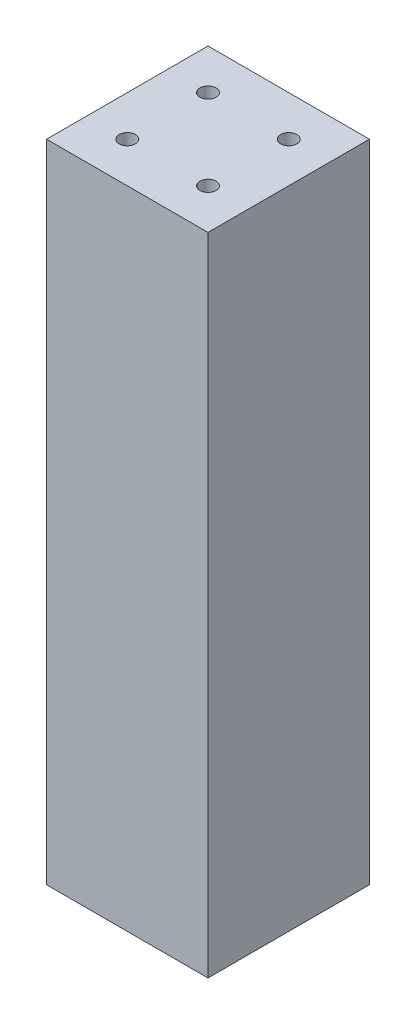
ISO-10303-21;
HEADER;
FILE_DESCRIPTION(('STEP AP214'),'2;1');
FILE_NAME('part.step','',(''),(''),'','','');
FILE_SCHEMA(('AUTOMOTIVE_DESIGN { 1 0 10303 214 1 1 1 1 }'));
ENDSEC;
DATA;
#1=APPLICATION_CONTEXT('core data for automotive mechanical design processes');
#2=APPLICATION_PROTOCOL_DEFINITION('international standard','automotive_design',2000,#1);
#3=PRODUCT_CONTEXT('',#1,'mechanical');
#4=PRODUCT('Part','Part','',(#3));
#5=PRODUCT_RELATED_PRODUCT_CATEGORY('part','',(#4));
#6=PRODUCT_DEFINITION_FORMATION('','',#4);
#7=PRODUCT_DEFINITION_CONTEXT('part definition',#1,'design');
#8=PRODUCT_DEFINITION('design','',#6,#7);
#9=PRODUCT_DEFINITION_SHAPE('','',#8);
#10=(LENGTH_UNIT() NAMED_UNIT(*) SI_UNIT(.MILLI.,.METRE.));
#11=(NAMED_UNIT(*) PLANE_ANGLE_UNIT() SI_UNIT($,.RADIAN.));
#12=(NAMED_UNIT(*) SI_UNIT($,.STERADIAN.) SOLID_ANGLE_UNIT());
#13=UNCERTAINTY_MEASURE_WITH_UNIT(LENGTH_MEASURE(1.E-05),#10,'distance_accuracy_value','');
#14=(GEOMETRIC_REPRESENTATION_CONTEXT(3) GLOBAL_UNCERTAINTY_ASSIGNED_CONTEXT((#13)) GLOBAL_UNIT_ASSIGNED_CONTEXT((#10,
#11,#12)) REPRESENTATION_CONTEXT('',''));
#15=CARTESIAN_POINT('',(0.,0.,0.));
#16=DIRECTION('',(0.,0.,1.));
#17=DIRECTION('',(1.,0.,0.));
#18=AXIS2_PLACEMENT_3D('',#15,#16,#17);
#19=CARTESIAN_POINT('',(25.4,203.2,25.4));
#20=DIRECTION('',(-1.,0.,0.));
#21=DIRECTION('',(0.,0.,1.));
#22=AXIS2_PLACEMENT_3D('',#19,#20,#21);
#23=PLANE('',#22);
#24=DIRECTION('',(0.,0.,-1.));
#25=VECTOR('',#24,1.);
#26=CARTESIAN_POINT('',(25.4,0.,25.4));
#27=LINE('',#26,#25);
#28=CARTESIAN_POINT('',(25.4,0.,25.4));
#29=VERTEX_POINT('',#28);
#30=CARTESIAN_POINT('',(25.4,0.,-25.4));
#31=VERTEX_POINT('',#30);
#32=EDGE_CURVE('E181',#29,#31,#27,.T.);
#33=ORIENTED_EDGE('',*,*,#32,.T.);
#34=DIRECTION('',(0.,-1.,0.));
#35=VECTOR('',#34,1.);
#36=CARTESIAN_POINT('',(25.4,203.2,-25.4));
#37=LINE('',#36,#35);
#38=CARTESIAN_POINT('',(25.4,203.2,-25.4));
#39=VERTEX_POINT('',#38);
#40=EDGE_CURVE('E13',#39,#31,#37,.T.);
#41=ORIENTED_EDGE('',*,*,#40,.F.);
#42=DIRECTION('',(0.,0.,-1.));
#43=VECTOR('',#42,1.);
#44=CARTESIAN_POINT('',(25.4,203.2,25.4));
#45=LINE('',#44,#43);
#46=CARTESIAN_POINT('',(25.4,203.2,25.4));
#47=VERTEX_POINT('',#46);
#48=EDGE_CURVE('E182',#47,#39,#45,.T.);
#49=ORIENTED_EDGE('',*,*,#48,.F.);
#50=DIRECTION('',(0.,-1.,0.));
#51=VECTOR('',#50,1.);
#52=CARTESIAN_POINT('',(25.4,203.2,25.4));
#53=LINE('',#52,#51);
#54=EDGE_CURVE('E188',#47,#29,#53,.T.);
#55=ORIENTED_EDGE('',*,*,#54,.T.);
#56=EDGE_LOOP('',(#33,#41,#49,#55));
#57=FACE_BOUND('',#56,.T.);
#58=ADVANCED_FACE('F52',(#57),#23,.F.);
#59=CARTESIAN_POINT('',(-25.4,203.2,-25.4));
#60=DIRECTION('',(0.,0.,1.));
#61=DIRECTION('',(1.,0.,0.));
#62=AXIS2_PLACEMENT_3D('',#59,#60,#61);
#63=PLANE('',#62);
#64=DIRECTION('',(-1.,0.,0.));
#65=VECTOR('',#64,1.);
#66=CARTESIAN_POINT('',(-25.4,0.,-25.4));
#67=LINE('',#66,#65);
#68=CARTESIAN_POINT('',(-25.4,0.,-25.4));
#69=VERTEX_POINT('',#68);
#70=EDGE_CURVE('E191',#31,#69,#67,.T.);
#71=ORIENTED_EDGE('',*,*,#70,.T.);
#72=DIRECTION('',(0.,-1.,0.));
#73=VECTOR('',#72,1.);
#74=CARTESIAN_POINT('',(-25.4,203.2,-25.4));
#75=LINE('',#74,#73);
#76=CARTESIAN_POINT('',(-25.4,203.2,-25.4));
#77=VERTEX_POINT('',#76);
#78=EDGE_CURVE('E60',#77,#69,#75,.T.);
#79=ORIENTED_EDGE('',*,*,#78,.F.);
#80=DIRECTION('',(-1.,0.,0.));
#81=VECTOR('',#80,1.);
#82=CARTESIAN_POINT('',(-25.4,203.2,-25.4));
#83=LINE('',#82,#81);
#84=EDGE_CURVE('E99',#39,#77,#83,.T.);
#85=ORIENTED_EDGE('',*,*,#84,.F.);
#86=ORIENTED_EDGE('',*,*,#40,.T.);
#87=EDGE_LOOP('',(#71,#79,#85,#86));
#88=FACE_BOUND('',#87,.T.);
#89=ADVANCED_FACE('F215',(#88),#63,.F.);
#90=CARTESIAN_POINT('',(-25.4,203.2,25.4));
#91=DIRECTION('',(1.,0.,0.));
#92=DIRECTION('',(0.,0.,-1.));
#93=AXIS2_PLACEMENT_3D('',#90,#91,#92);
#94=PLANE('',#93);
#95=DIRECTION('',(0.,0.,1.));
#96=VECTOR('',#95,1.);
#97=CARTESIAN_POINT('',(-25.4,0.,25.4));
#98=LINE('',#97,#96);
#99=CARTESIAN_POINT('',(-25.4,0.,25.4));
#100=VERTEX_POINT('',#99);
#101=EDGE_CURVE('E86',#69,#100,#98,.T.);
#102=ORIENTED_EDGE('',*,*,#101,.T.);
#103=DIRECTION('',(0.,-1.,0.));
#104=VECTOR('',#103,1.);
#105=CARTESIAN_POINT('',(-25.4,203.2,25.4));
#106=LINE('',#105,#104);
#107=CARTESIAN_POINT('',(-25.4,203.2,25.4));
#108=VERTEX_POINT('',#107);
#109=EDGE_CURVE('E196',#108,#100,#106,.T.);
#110=ORIENTED_EDGE('',*,*,#109,.F.);
#111=DIRECTION('',(0.,0.,1.));
#112=VECTOR('',#111,1.);
#113=CARTESIAN_POINT('',(-25.4,203.2,25.4));
#114=LINE('',#113,#112);
#115=EDGE_CURVE('E185',#77,#108,#114,.T.);
#116=ORIENTED_EDGE('',*,*,#115,.F.);
#117=ORIENTED_EDGE('',*,*,#78,.T.);
#118=EDGE_LOOP('',(#102,#110,#116,#117));
#119=FACE_BOUND('',#118,.T.);
#120=ADVANCED_FACE('F198',(#119),#94,.F.);
#121=CARTESIAN_POINT('',(-25.4,203.2,25.4));
#122=DIRECTION('',(0.,0.,-1.));
#123=DIRECTION('',(-1.,0.,0.));
#124=AXIS2_PLACEMENT_3D('',#121,#122,#123);
#125=PLANE('',#124);
#126=DIRECTION('',(1.,0.,0.));
#127=VECTOR('',#126,1.);
#128=CARTESIAN_POINT('',(-25.4,0.,25.4));
#129=LINE('',#128,#127);
#130=EDGE_CURVE('E92',#100,#29,#129,.T.);
#131=ORIENTED_EDGE('',*,*,#130,.T.);
#132=ORIENTED_EDGE('',*,*,#54,.F.);
#133=DIRECTION('',(1.,0.,0.));
#134=VECTOR('',#133,1.);
#135=CARTESIAN_POINT('',(-25.4,203.2,25.4));
#136=LINE('',#135,#134);
#137=EDGE_CURVE('E68',#108,#47,#136,.T.);
#138=ORIENTED_EDGE('',*,*,#137,.F.);
#139=ORIENTED_EDGE('',*,*,#109,.T.);
#140=EDGE_LOOP('',(#131,#132,#138,#139));
#141=FACE_BOUND('',#140,.T.);
#142=ADVANCED_FACE('F205',(#141),#125,.F.);
#143=CARTESIAN_POINT('',(0.,203.2,0.));
#144=DIRECTION('',(0.,-1.,0.));
#145=DIRECTION('',(0.,0.,-1.));
#146=AXIS2_PLACEMENT_3D('',#143,#144,#145);
#147=PLANE('',#146);
#148=CARTESIAN_POINT('',(-12.7,203.2,-12.7));
#149=DIRECTION('',(0.,1.,0.));
#150=DIRECTION('',(0.,0.,1.));
#151=AXIS2_PLACEMENT_3D('',#148,#149,#150);
#152=CIRCLE('',#151,2.55269999999999);
#153=CARTESIAN_POINT('',(-12.7,203.2,-10.1473));
#154=VERTEX_POINT('',#153);
#155=EDGE_CURVE('E157',#154,#154,#152,.T.);
#156=ORIENTED_EDGE('',*,*,#155,.F.);
#157=EDGE_LOOP('',(#156));
#158=FACE_BOUND('',#157,.T.);
#159=CARTESIAN_POINT('',(12.7,203.2,-12.7));
#160=DIRECTION('',(0.,1.,0.));
#161=DIRECTION('',(0.,0.,1.));
#162=AXIS2_PLACEMENT_3D('',#159,#160,#161);
#163=CIRCLE('',#162,2.55269999999999);
#164=CARTESIAN_POINT('',(12.7,203.2,-10.1473));
#165=VERTEX_POINT('',#164);
#166=EDGE_CURVE('E163',#165,#165,#163,.T.);
#167=ORIENTED_EDGE('',*,*,#166,.F.);
#168=EDGE_LOOP('',(#167));
#169=FACE_BOUND('',#168,.T.);
#170=CARTESIAN_POINT('',(12.7,203.2,12.7));
#171=DIRECTION('',(0.,1.,0.));
#172=DIRECTION('',(0.,0.,1.));
#173=AXIS2_PLACEMENT_3D('',#170,#171,#172);
#174=CIRCLE('',#173,2.55269999999999);
#175=CARTESIAN_POINT('',(12.7,203.2,15.2527));
#176=VERTEX_POINT('',#175);
#177=EDGE_CURVE('E169',#176,#176,#174,.T.);
#178=ORIENTED_EDGE('',*,*,#177,.F.);
#179=EDGE_LOOP('',(#178));
#180=FACE_BOUND('',#179,.T.);
#181=CARTESIAN_POINT('',(-12.7,203.2,12.7));
#182=DIRECTION('',(0.,1.,0.));
#183=DIRECTION('',(0.,0.,1.));
#184=AXIS2_PLACEMENT_3D('',#181,#182,#183);
#185=CIRCLE('',#184,2.55269999999999);
#186=CARTESIAN_POINT('',(-12.7,203.2,15.2527));
#187=VERTEX_POINT('',#186);
#188=EDGE_CURVE('E175',#187,#187,#185,.T.);
#189=ORIENTED_EDGE('',*,*,#188,.F.);
#190=EDGE_LOOP('',(#189));
#191=FACE_BOUND('',#190,.T.);
#192=ORIENTED_EDGE('',*,*,#48,.T.);
#193=ORIENTED_EDGE('',*,*,#84,.T.);
#194=ORIENTED_EDGE('',*,*,#115,.T.);
#195=ORIENTED_EDGE('',*,*,#137,.T.);
#196=EDGE_LOOP('',(#192,#193,#194,#195));
#197=FACE_BOUND('',#196,.T.);
#198=ADVANCED_FACE('F207',(#158,#169,#180,#191,#197),#147,.F.);
#199=CARTESIAN_POINT('',(0.,0.,0.));
#200=DIRECTION('',(0.,-1.,0.));
#201=DIRECTION('',(0.,0.,-1.));
#202=AXIS2_PLACEMENT_3D('',#199,#200,#201);
#203=PLANE('',#202);
#204=CARTESIAN_POINT('',(12.7,0.,-12.7));
#205=DIRECTION('',(0.,-1.,0.));
#206=DIRECTION('',(0.,0.,-1.));
#207=AXIS2_PLACEMENT_3D('',#204,#205,#206);
#208=CIRCLE('',#207,2.55269999999999);
#209=CARTESIAN_POINT('',(12.7,0.,-15.2527));
#210=VERTEX_POINT('',#209);
#211=EDGE_CURVE('E135',#210,#210,#208,.T.);
#212=ORIENTED_EDGE('',*,*,#211,.F.);
#213=EDGE_LOOP('',(#212));
#214=FACE_BOUND('',#213,.T.);
#215=CARTESIAN_POINT('',(-12.7,0.,-12.7));
#216=DIRECTION('',(0.,-1.,0.));
#217=DIRECTION('',(0.,0.,-1.));
#218=AXIS2_PLACEMENT_3D('',#215,#216,#217);
#219=CIRCLE('',#218,2.55269999999999);
#220=CARTESIAN_POINT('',(-12.7,0.,-15.2527));
#221=VERTEX_POINT('',#220);
#222=EDGE_CURVE('E134',#221,#221,#219,.T.);
#223=ORIENTED_EDGE('',*,*,#222,.F.);
#224=EDGE_LOOP('',(#223));
#225=FACE_BOUND('',#224,.T.);
#226=CARTESIAN_POINT('',(-12.7,0.,12.7));
#227=DIRECTION('',(0.,-1.,0.));
#228=DIRECTION('',(0.,0.,-1.));
#229=AXIS2_PLACEMENT_3D('',#226,#227,#228);
#230=CIRCLE('',#229,2.55269999999999);
#231=CARTESIAN_POINT('',(-12.7,0.,10.1473));
#232=VERTEX_POINT('',#231);
#233=EDGE_CURVE('E145',#232,#232,#230,.T.);
#234=ORIENTED_EDGE('',*,*,#233,.F.);
#235=EDGE_LOOP('',(#234));
#236=FACE_BOUND('',#235,.T.);
#237=CARTESIAN_POINT('',(12.7,0.,12.7));
#238=DIRECTION('',(0.,-1.,0.));
#239=DIRECTION('',(0.,0.,-1.));
#240=AXIS2_PLACEMENT_3D('',#237,#238,#239);
#241=CIRCLE('',#240,2.55269999999999);
#242=CARTESIAN_POINT('',(12.7,0.,10.1473));
#243=VERTEX_POINT('',#242);
#244=EDGE_CURVE('E151',#243,#243,#241,.T.);
#245=ORIENTED_EDGE('',*,*,#244,.F.);
#246=EDGE_LOOP('',(#245));
#247=FACE_BOUND('',#246,.T.);
#248=ORIENTED_EDGE('',*,*,#32,.F.);
#249=ORIENTED_EDGE('',*,*,#130,.F.);
#250=ORIENTED_EDGE('',*,*,#101,.F.);
#251=ORIENTED_EDGE('',*,*,#70,.F.);
#252=EDGE_LOOP('',(#248,#249,#250,#251));
#253=FACE_BOUND('',#252,.T.);
#254=ADVANCED_FACE('F201',(#214,#225,#236,#247,#253),#203,.T.);
#255=CARTESIAN_POINT('',(-12.7,186.69,12.7));
#256=DIRECTION('',(0.,1.,0.));
#257=DIRECTION('',(0.,0.,1.));
#258=AXIS2_PLACEMENT_3D('',#255,#256,#257);
#259=CONICAL_SURFACE('',#258,2.55269999999999,1.02974425867665);
#260=CARTESIAN_POINT('',(-12.7,185.156183097808,12.7));
#261=VERTEX_POINT('',#260);
#262=VERTEX_LOOP('',#261);
#263=FACE_BOUND('',#262,.T.);
#264=CARTESIAN_POINT('',(-12.7,186.69,12.7));
#265=DIRECTION('',(0.,1.,0.));
#266=DIRECTION('',(0.,0.,1.));
#267=AXIS2_PLACEMENT_3D('',#264,#265,#266);
#268=CIRCLE('',#267,2.55269999999999);
#269=CARTESIAN_POINT('',(-12.7,186.69,15.2527));
#270=VERTEX_POINT('',#269);
#271=EDGE_CURVE('E178',#270,#270,#268,.T.);
#272=ORIENTED_EDGE('',*,*,#271,.T.);
#273=EDGE_LOOP('',(#272));
#274=FACE_BOUND('',#273,.T.);
#275=ADVANCED_FACE('F245',(#263,#274),#259,.F.);
#276=CARTESIAN_POINT('',(-12.7,203.2,12.7));
#277=DIRECTION('',(0.,1.,0.));
#278=DIRECTION('',(0.,0.,1.));
#279=AXIS2_PLACEMENT_3D('',#276,#277,#278);
#280=CYLINDRICAL_SURFACE('',#279,2.55269999999999);
#281=ORIENTED_EDGE('',*,*,#271,.F.);
#282=EDGE_LOOP('',(#281));
#283=FACE_BOUND('',#282,.T.);
#284=ORIENTED_EDGE('',*,*,#188,.T.);
#285=EDGE_LOOP('',(#284));
#286=FACE_BOUND('',#285,.T.);
#287=ADVANCED_FACE('F250',(#283,#286),#280,.F.);
#288=CARTESIAN_POINT('',(12.7,186.69,12.7));
#289=DIRECTION('',(0.,1.,0.));
#290=DIRECTION('',(0.,0.,1.));
#291=AXIS2_PLACEMENT_3D('',#288,#289,#290);
#292=CONICAL_SURFACE('',#291,2.55269999999999,1.02974425867665);
#293=CARTESIAN_POINT('',(12.7,185.156183097808,12.7));
#294=VERTEX_POINT('',#293);
#295=VERTEX_LOOP('',#294);
#296=FACE_BOUND('',#295,.T.);
#297=CARTESIAN_POINT('',(12.7,186.69,12.7));
#298=DIRECTION('',(0.,1.,0.));
#299=DIRECTION('',(0.,0.,1.));
#300=AXIS2_PLACEMENT_3D('',#297,#298,#299);
#301=CIRCLE('',#300,2.55269999999999);
#302=CARTESIAN_POINT('',(12.7,186.69,15.2527));
#303=VERTEX_POINT('',#302);
#304=EDGE_CURVE('E172',#303,#303,#301,.T.);
#305=ORIENTED_EDGE('',*,*,#304,.T.);
#306=EDGE_LOOP('',(#305));
#307=FACE_BOUND('',#306,.T.);
#308=ADVANCED_FACE('F261',(#296,#307),#292,.F.);
#309=CARTESIAN_POINT('',(12.7,203.2,12.7));
#310=DIRECTION('',(0.,1.,0.));
#311=DIRECTION('',(0.,0.,1.));
#312=AXIS2_PLACEMENT_3D('',#309,#310,#311);
#313=CYLINDRICAL_SURFACE('',#312,2.55269999999999);
#314=ORIENTED_EDGE('',*,*,#304,.F.);
#315=EDGE_LOOP('',(#314));
#316=FACE_BOUND('',#315,.T.);
#317=ORIENTED_EDGE('',*,*,#177,.T.);
#318=EDGE_LOOP('',(#317));
#319=FACE_BOUND('',#318,.T.);
#320=ADVANCED_FACE('F274',(#316,#319),#313,.F.);
#321=CARTESIAN_POINT('',(12.7,186.69,-12.7));
#322=DIRECTION('',(0.,1.,0.));
#323=DIRECTION('',(0.,0.,1.));
#324=AXIS2_PLACEMENT_3D('',#321,#322,#323);
#325=CONICAL_SURFACE('',#324,2.55269999999999,1.02974425867665);
#326=CARTESIAN_POINT('',(12.7,185.156183097808,-12.7));
#327=VERTEX_POINT('',#326);
#328=VERTEX_LOOP('',#327);
#329=FACE_BOUND('',#328,.T.);
#330=CARTESIAN_POINT('',(12.7,186.69,-12.7));
#331=DIRECTION('',(0.,1.,0.));
#332=DIRECTION('',(0.,0.,1.));
#333=AXIS2_PLACEMENT_3D('',#330,#331,#332);
#334=CIRCLE('',#333,2.55269999999999);
#335=CARTESIAN_POINT('',(12.7,186.69,-10.1473));
#336=VERTEX_POINT('',#335);
#337=EDGE_CURVE('E166',#336,#336,#334,.T.);
#338=ORIENTED_EDGE('',*,*,#337,.T.);
#339=EDGE_LOOP('',(#338));
#340=FACE_BOUND('',#339,.T.);
#341=ADVANCED_FACE('F284',(#329,#340),#325,.F.);
#342=CARTESIAN_POINT('',(12.7,203.2,-12.7));
#343=DIRECTION('',(0.,1.,0.));
#344=DIRECTION('',(0.,0.,1.));
#345=AXIS2_PLACEMENT_3D('',#342,#343,#344);
#346=CYLINDRICAL_SURFACE('',#345,2.55269999999999);
#347=ORIENTED_EDGE('',*,*,#337,.F.);
#348=EDGE_LOOP('',(#347));
#349=FACE_BOUND('',#348,.T.);
#350=ORIENTED_EDGE('',*,*,#166,.T.);
#351=EDGE_LOOP('',(#350));
#352=FACE_BOUND('',#351,.T.);
#353=ADVANCED_FACE('F296',(#349,#352),#346,.F.);
#354=CARTESIAN_POINT('',(-12.7,186.69,-12.7));
#355=DIRECTION('',(0.,1.,0.));
#356=DIRECTION('',(0.,0.,1.));
#357=AXIS2_PLACEMENT_3D('',#354,#355,#356);
#358=CONICAL_SURFACE('',#357,2.55269999999999,1.02974425867665);
#359=CARTESIAN_POINT('',(-12.7,185.156183097808,-12.7));
#360=VERTEX_POINT('',#359);
#361=VERTEX_LOOP('',#360);
#362=FACE_BOUND('',#361,.T.);
#363=CARTESIAN_POINT('',(-12.7,186.69,-12.7));
#364=DIRECTION('',(0.,1.,0.));
#365=DIRECTION('',(0.,0.,1.));
#366=AXIS2_PLACEMENT_3D('',#363,#364,#365);
#367=CIRCLE('',#366,2.55269999999999);
#368=CARTESIAN_POINT('',(-12.7,186.69,-10.1473));
#369=VERTEX_POINT('',#368);
#370=EDGE_CURVE('E160',#369,#369,#367,.T.);
#371=ORIENTED_EDGE('',*,*,#370,.T.);
#372=EDGE_LOOP('',(#371));
#373=FACE_BOUND('',#372,.T.);
#374=ADVANCED_FACE('F306',(#362,#373),#358,.F.);
#375=CARTESIAN_POINT('',(-12.7,203.2,-12.7));
#376=DIRECTION('',(0.,1.,0.));
#377=DIRECTION('',(0.,0.,1.));
#378=AXIS2_PLACEMENT_3D('',#375,#376,#377);
#379=CYLINDRICAL_SURFACE('',#378,2.55269999999999);
#380=ORIENTED_EDGE('',*,*,#370,.F.);
#381=EDGE_LOOP('',(#380));
#382=FACE_BOUND('',#381,.T.);
#383=ORIENTED_EDGE('',*,*,#155,.T.);
#384=EDGE_LOOP('',(#383));
#385=FACE_BOUND('',#384,.T.);
#386=ADVANCED_FACE('F317',(#382,#385),#379,.F.);
#387=CARTESIAN_POINT('',(12.7,16.51,12.7));
#388=DIRECTION('',(0.,-1.,0.));
#389=DIRECTION('',(0.,0.,-1.));
#390=AXIS2_PLACEMENT_3D('',#387,#388,#389);
#391=CONICAL_SURFACE('',#390,2.55269999999999,1.02974425867665);
#392=CARTESIAN_POINT('',(12.7,18.0438169021916,12.7));
#393=VERTEX_POINT('',#392);
#394=VERTEX_LOOP('',#393);
#395=FACE_BOUND('',#394,.T.);
#396=CARTESIAN_POINT('',(12.7,16.51,12.7));
#397=DIRECTION('',(0.,-1.,0.));
#398=DIRECTION('',(0.,0.,-1.));
#399=AXIS2_PLACEMENT_3D('',#396,#397,#398);
#400=CIRCLE('',#399,2.55269999999999);
#401=CARTESIAN_POINT('',(12.7,16.51,10.1473));
#402=VERTEX_POINT('',#401);
#403=EDGE_CURVE('E154',#402,#402,#400,.T.);
#404=ORIENTED_EDGE('',*,*,#403,.T.);
#405=EDGE_LOOP('',(#404));
#406=FACE_BOUND('',#405,.T.);
#407=ADVANCED_FACE('F327',(#395,#406),#391,.F.);
#408=CARTESIAN_POINT('',(12.7,0.,12.7));
#409=DIRECTION('',(0.,-1.,0.));
#410=DIRECTION('',(0.,0.,-1.));
#411=AXIS2_PLACEMENT_3D('',#408,#409,#410);
#412=CYLINDRICAL_SURFACE('',#411,2.55269999999999);
#413=ORIENTED_EDGE('',*,*,#403,.F.);
#414=EDGE_LOOP('',(#413));
#415=FACE_BOUND('',#414,.T.);
#416=ORIENTED_EDGE('',*,*,#244,.T.);
#417=EDGE_LOOP('',(#416));
#418=FACE_BOUND('',#417,.T.);
#419=ADVANCED_FACE('F345',(#415,#418),#412,.F.);
#420=CARTESIAN_POINT('',(-12.7,16.51,12.7));
#421=DIRECTION('',(0.,-1.,0.));
#422=DIRECTION('',(0.,0.,-1.));
#423=AXIS2_PLACEMENT_3D('',#420,#421,#422);
#424=CONICAL_SURFACE('',#423,2.55269999999999,1.02974425867665);
#425=CARTESIAN_POINT('',(-12.7,18.0438169021916,12.7));
#426=VERTEX_POINT('',#425);
#427=VERTEX_LOOP('',#426);
#428=FACE_BOUND('',#427,.T.);
#429=CARTESIAN_POINT('',(-12.7,16.51,12.7));
#430=DIRECTION('',(0.,-1.,0.));
#431=DIRECTION('',(0.,0.,-1.));
#432=AXIS2_PLACEMENT_3D('',#429,#430,#431);
#433=CIRCLE('',#432,2.55269999999999);
#434=CARTESIAN_POINT('',(-12.7,16.51,10.1473));
#435=VERTEX_POINT('',#434);
#436=EDGE_CURVE('E148',#435,#435,#433,.T.);
#437=ORIENTED_EDGE('',*,*,#436,.T.);
#438=EDGE_LOOP('',(#437));
#439=FACE_BOUND('',#438,.T.);
#440=ADVANCED_FACE('F356',(#428,#439),#424,.F.);
#441=CARTESIAN_POINT('',(-12.7,0.,12.7));
#442=DIRECTION('',(0.,-1.,0.));
#443=DIRECTION('',(0.,0.,-1.));
#444=AXIS2_PLACEMENT_3D('',#441,#442,#443);
#445=CYLINDRICAL_SURFACE('',#444,2.55269999999999);
#446=ORIENTED_EDGE('',*,*,#436,.F.);
#447=EDGE_LOOP('',(#446));
#448=FACE_BOUND('',#447,.T.);
#449=ORIENTED_EDGE('',*,*,#233,.T.);
#450=EDGE_LOOP('',(#449));
#451=FACE_BOUND('',#450,.T.);
#452=ADVANCED_FACE('F368',(#448,#451),#445,.F.);
#453=CARTESIAN_POINT('',(-12.7,16.51,-12.7));
#454=DIRECTION('',(0.,-1.,0.));
#455=DIRECTION('',(0.,0.,-1.));
#456=AXIS2_PLACEMENT_3D('',#453,#454,#455);
#457=CONICAL_SURFACE('',#456,2.55269999999999,1.02974425867665);
#458=CARTESIAN_POINT('',(-12.7,18.0438169021916,-12.7));
#459=VERTEX_POINT('',#458);
#460=VERTEX_LOOP('',#459);
#461=FACE_BOUND('',#460,.T.);
#462=CARTESIAN_POINT('',(-12.7,16.51,-12.7));
#463=DIRECTION('',(0.,-1.,0.));
#464=DIRECTION('',(0.,0.,-1.));
#465=AXIS2_PLACEMENT_3D('',#462,#463,#464);
#466=CIRCLE('',#465,2.55269999999999);
#467=CARTESIAN_POINT('',(-12.7,16.51,-15.2527));
#468=VERTEX_POINT('',#467);
#469=EDGE_CURVE('E138',#468,#468,#466,.T.);
#470=ORIENTED_EDGE('',*,*,#469,.T.);
#471=EDGE_LOOP('',(#470));
#472=FACE_BOUND('',#471,.T.);
#473=ADVANCED_FACE('F378',(#461,#472),#457,.F.);
#474=CARTESIAN_POINT('',(-12.7,0.,-12.7));
#475=DIRECTION('',(0.,-1.,0.));
#476=DIRECTION('',(0.,0.,-1.));
#477=AXIS2_PLACEMENT_3D('',#474,#475,#476);
#478=CYLINDRICAL_SURFACE('',#477,2.55269999999999);
#479=ORIENTED_EDGE('',*,*,#469,.F.);
#480=EDGE_LOOP('',(#479));
#481=FACE_BOUND('',#480,.T.);
#482=ORIENTED_EDGE('',*,*,#222,.T.);
#483=EDGE_LOOP('',(#482));
#484=FACE_BOUND('',#483,.T.);
#485=ADVANCED_FACE('F128',(#481,#484),#478,.F.);
#486=CARTESIAN_POINT('',(12.7,16.51,-12.7));
#487=DIRECTION('',(0.,-1.,0.));
#488=DIRECTION('',(0.,0.,-1.));
#489=AXIS2_PLACEMENT_3D('',#486,#487,#488);
#490=CONICAL_SURFACE('',#489,2.55269999999999,1.02974425867665);
#491=CARTESIAN_POINT('',(12.7,18.0438169021916,-12.7));
#492=VERTEX_POINT('',#491);
#493=VERTEX_LOOP('',#492);
#494=FACE_BOUND('',#493,.T.);
#495=CARTESIAN_POINT('',(12.7,16.51,-12.7));
#496=DIRECTION('',(0.,-1.,0.));
#497=DIRECTION('',(0.,0.,-1.));
#498=AXIS2_PLACEMENT_3D('',#495,#496,#497);
#499=CIRCLE('',#498,2.55269999999999);
#500=CARTESIAN_POINT('',(12.7,16.51,-15.2527));
#501=VERTEX_POINT('',#500);
#502=EDGE_CURVE('E132',#501,#501,#499,.T.);
#503=ORIENTED_EDGE('',*,*,#502,.T.);
#504=EDGE_LOOP('',(#503));
#505=FACE_BOUND('',#504,.T.);
#506=ADVANCED_FACE('F124',(#494,#505),#490,.F.);
#507=CARTESIAN_POINT('',(12.7,0.,-12.7));
#508=DIRECTION('',(0.,-1.,0.));
#509=DIRECTION('',(0.,0.,-1.));
#510=AXIS2_PLACEMENT_3D('',#507,#508,#509);
#511=CYLINDRICAL_SURFACE('',#510,2.55269999999999);
#512=ORIENTED_EDGE('',*,*,#502,.F.);
#513=EDGE_LOOP('',(#512));
#514=FACE_BOUND('',#513,.T.);
#515=ORIENTED_EDGE('',*,*,#211,.T.);
#516=EDGE_LOOP('',(#515));
#517=FACE_BOUND('',#516,.T.);
#518=ADVANCED_FACE('F127',(#514,#517),#511,.F.);
#519=CLOSED_SHELL('',(#58,#89,#120,#142,#198,#254,#275,#287,#308,#320,#341,#353,#374,#386,#407,
#419,#440,#452,#473,#485,#506,#518));
#520=MANIFOLD_SOLID_BREP('B2',#519);
#521=ADVANCED_BREP_SHAPE_REPRESENTATION('',(#18,#520),#14);
#522=SHAPE_DEFINITION_REPRESENTATION(#9,#521);
ENDSEC;
END-ISO-10303-21;
